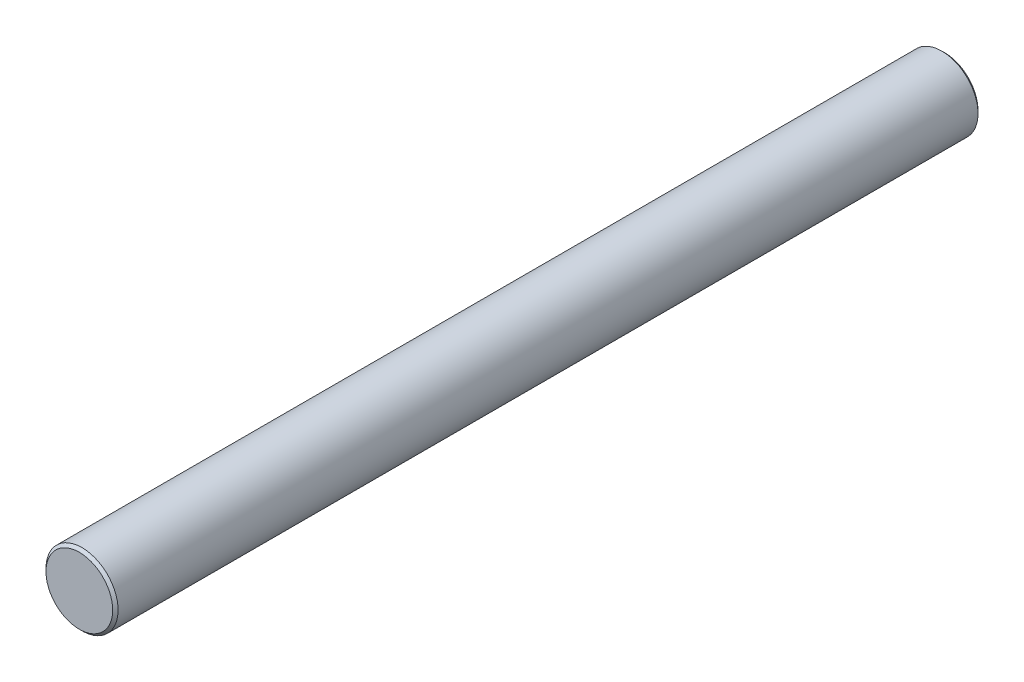
ISO-10303-21;
HEADER;
FILE_DESCRIPTION(('STEP AP214'),'2;1');
FILE_NAME('part.step','',(''),(''),'','','');
FILE_SCHEMA(('AUTOMOTIVE_DESIGN { 1 0 10303 214 1 1 1 1 }'));
ENDSEC;
DATA;
#1=APPLICATION_CONTEXT('core data for automotive mechanical design processes');
#2=APPLICATION_PROTOCOL_DEFINITION('international standard','automotive_design',2000,#1);
#3=PRODUCT_CONTEXT('',#1,'mechanical');
#4=PRODUCT('Part','Part','',(#3));
#5=PRODUCT_RELATED_PRODUCT_CATEGORY('part','',(#4));
#6=PRODUCT_DEFINITION_FORMATION('','',#4);
#7=PRODUCT_DEFINITION_CONTEXT('part definition',#1,'design');
#8=PRODUCT_DEFINITION('design','',#6,#7);
#9=PRODUCT_DEFINITION_SHAPE('','',#8);
#10=(LENGTH_UNIT() NAMED_UNIT(*) SI_UNIT(.MILLI.,.METRE.));
#11=(NAMED_UNIT(*) PLANE_ANGLE_UNIT() SI_UNIT($,.RADIAN.));
#12=(NAMED_UNIT(*) SI_UNIT($,.STERADIAN.) SOLID_ANGLE_UNIT());
#13=UNCERTAINTY_MEASURE_WITH_UNIT(LENGTH_MEASURE(1.E-05),#10,'distance_accuracy_value','');
#14=(GEOMETRIC_REPRESENTATION_CONTEXT(3) GLOBAL_UNCERTAINTY_ASSIGNED_CONTEXT((#13)) GLOBAL_UNIT_ASSIGNED_CONTEXT((#10,
#11,#12)) REPRESENTATION_CONTEXT('',''));
#15=CARTESIAN_POINT('',(0.,0.,0.));
#16=DIRECTION('',(0.,0.,1.));
#17=DIRECTION('',(1.,0.,0.));
#18=AXIS2_PLACEMENT_3D('',#15,#16,#17);
#19=CARTESIAN_POINT('',(0.,9.25,0.));
#20=DIRECTION('',(0.,0.,-1.));
#21=DIRECTION('',(0.,1.,0.));
#22=AXIS2_PLACEMENT_3D('',#19,#20,#21);
#23=PLANE('',#22);
#24=CARTESIAN_POINT('',(0.,0.,0.));
#25=DIRECTION('',(0.,0.,-1.));
#26=DIRECTION('',(0.,1.,0.));
#27=AXIS2_PLACEMENT_3D('',#24,#25,#26);
#28=CIRCLE('',#27,18.5);
#29=CARTESIAN_POINT('',(0.,18.5,0.));
#30=VERTEX_POINT('',#29);
#31=EDGE_CURVE('E9',#30,#30,#28,.T.);
#32=ORIENTED_EDGE('',*,*,#31,.T.);
#33=EDGE_LOOP('',(#32));
#34=FACE_BOUND('',#33,.T.);
#35=CARTESIAN_POINT('',(0.,0.,0.));
#36=DIRECTION('',(0.,0.,1.));
#37=DIRECTION('',(-1.,0.,0.));
#38=AXIS2_PLACEMENT_3D('',#35,#36,#37);
#39=CIRCLE('',#38,6.);
#40=CARTESIAN_POINT('',(-6.,0.,0.));
#41=VERTEX_POINT('',#40);
#42=EDGE_CURVE('E52',#41,#41,#39,.T.);
#43=ORIENTED_EDGE('',*,*,#42,.T.);
#44=EDGE_LOOP('',(#43));
#45=FACE_BOUND('',#44,.T.);
#46=ADVANCED_FACE('F15',(#34,#45),#23,.T.);
#47=CARTESIAN_POINT('',(0.,0.,0.75));
#48=DIRECTION('',(0.,0.,1.));
#49=DIRECTION('',(0.,1.,0.));
#50=AXIS2_PLACEMENT_3D('',#47,#48,#49);
#51=CONICAL_SURFACE('',#50,19.25,0.785398163397448);
#52=CARTESIAN_POINT('',(0.,0.,1.5));
#53=DIRECTION('',(0.,0.,-1.));
#54=DIRECTION('',(0.,1.,0.));
#55=AXIS2_PLACEMENT_3D('',#52,#53,#54);
#56=CIRCLE('',#55,20.);
#57=CARTESIAN_POINT('',(0.,20.,1.5));
#58=VERTEX_POINT('',#57);
#59=EDGE_CURVE('E25',#58,#58,#56,.T.);
#60=ORIENTED_EDGE('',*,*,#59,.T.);
#61=EDGE_LOOP('',(#60));
#62=FACE_BOUND('',#61,.T.);
#63=ORIENTED_EDGE('',*,*,#31,.F.);
#64=EDGE_LOOP('',(#63));
#65=FACE_BOUND('',#64,.T.);
#66=ADVANCED_FACE('F121',(#62,#65),#51,.T.);
#67=CARTESIAN_POINT('',(0.,0.,240.));
#68=DIRECTION('',(0.,0.,1.));
#69=DIRECTION('',(0.,1.,0.));
#70=AXIS2_PLACEMENT_3D('',#67,#68,#69);
#71=CYLINDRICAL_SURFACE('',#70,20.);
#72=CARTESIAN_POINT('',(0.,0.,478.5));
#73=DIRECTION('',(0.,0.,-1.));
#74=DIRECTION('',(0.,1.,0.));
#75=AXIS2_PLACEMENT_3D('',#72,#73,#74);
#76=CIRCLE('',#75,20.);
#77=CARTESIAN_POINT('',(0.,20.,478.5));
#78=VERTEX_POINT('',#77);
#79=EDGE_CURVE('E19',#78,#78,#76,.T.);
#80=ORIENTED_EDGE('',*,*,#79,.T.);
#81=EDGE_LOOP('',(#80));
#82=FACE_BOUND('',#81,.T.);
#83=ORIENTED_EDGE('',*,*,#59,.F.);
#84=EDGE_LOOP('',(#83));
#85=FACE_BOUND('',#84,.T.);
#86=CARTESIAN_POINT('',(0.,0.,6.5));
#87=DIRECTION('',(0.,0.,-1.));
#88=DIRECTION('',(0.,1.,0.));
#89=AXIS2_PLACEMENT_3D('',#86,#87,#88);
#90=CIRCLE('',#89,20.);
#91=CARTESIAN_POINT('',(10.5356537528527,-17.,6.5));
#92=VERTEX_POINT('',#91);
#93=CARTESIAN_POINT('',(-10.5356537528527,-17.,6.5));
#94=VERTEX_POINT('',#93);
#95=EDGE_CURVE('E69',#92,#94,#90,.T.);
#96=ORIENTED_EDGE('',*,*,#95,.T.);
#97=DIRECTION('',(0.,0.,1.));
#98=VECTOR('',#97,1.);
#99=CARTESIAN_POINT('',(-10.5356537528527,-17.,8.25));
#100=LINE('',#99,#98);
#101=CARTESIAN_POINT('',(-10.5356537528527,-17.,10.));
#102=VERTEX_POINT('',#101);
#103=EDGE_CURVE('E62',#94,#102,#100,.T.);
#104=ORIENTED_EDGE('',*,*,#103,.T.);
#105=CARTESIAN_POINT('',(0.,0.,10.));
#106=DIRECTION('',(0.,0.,1.));
#107=DIRECTION('',(0.,1.,0.));
#108=AXIS2_PLACEMENT_3D('',#105,#106,#107);
#109=CIRCLE('',#108,20.);
#110=CARTESIAN_POINT('',(10.5356537528527,-17.,10.));
#111=VERTEX_POINT('',#110);
#112=EDGE_CURVE('E75',#102,#111,#109,.T.);
#113=ORIENTED_EDGE('',*,*,#112,.T.);
#114=DIRECTION('',(0.,0.,-1.));
#115=VECTOR('',#114,1.);
#116=CARTESIAN_POINT('',(10.5356537528527,-17.,8.25));
#117=LINE('',#116,#115);
#118=EDGE_CURVE('E60',#111,#92,#117,.T.);
#119=ORIENTED_EDGE('',*,*,#118,.T.);
#120=EDGE_LOOP('',(#96,#104,#113,#119));
#121=FACE_BOUND('',#120,.T.);
#122=ADVANCED_FACE('F17',(#82,#85,#121),#71,.T.);
#123=CARTESIAN_POINT('',(0.,0.,479.25));
#124=DIRECTION('',(0.,0.,-1.));
#125=DIRECTION('',(0.,1.,0.));
#126=AXIS2_PLACEMENT_3D('',#123,#124,#125);
#127=CONICAL_SURFACE('',#126,19.25,0.785398163397448);
#128=CARTESIAN_POINT('',(0.,0.,480.));
#129=DIRECTION('',(0.,0.,-1.));
#130=DIRECTION('',(0.,1.,0.));
#131=AXIS2_PLACEMENT_3D('',#128,#129,#130);
#132=CIRCLE('',#131,18.5);
#133=CARTESIAN_POINT('',(0.,18.5,480.));
#134=VERTEX_POINT('',#133);
#135=EDGE_CURVE('E44',#134,#134,#132,.T.);
#136=ORIENTED_EDGE('',*,*,#135,.T.);
#137=EDGE_LOOP('',(#136));
#138=FACE_BOUND('',#137,.T.);
#139=ORIENTED_EDGE('',*,*,#79,.F.);
#140=EDGE_LOOP('',(#139));
#141=FACE_BOUND('',#140,.T.);
#142=ADVANCED_FACE('F116',(#138,#141),#127,.T.);
#143=CARTESIAN_POINT('',(0.,9.25,480.));
#144=DIRECTION('',(0.,0.,1.));
#145=DIRECTION('',(0.,-1.,0.));
#146=AXIS2_PLACEMENT_3D('',#143,#144,#145);
#147=PLANE('',#146);
#148=ORIENTED_EDGE('',*,*,#135,.F.);
#149=EDGE_LOOP('',(#148));
#150=FACE_BOUND('',#149,.T.);
#151=ADVANCED_FACE('F110',(#150),#147,.T.);
#152=CARTESIAN_POINT('',(0.,0.,26.4586213285198));
#153=DIRECTION('',(0.,0.,-1.));
#154=DIRECTION('',(-1.,0.,0.));
#155=AXIS2_PLACEMENT_3D('',#152,#153,#154);
#156=CONICAL_SURFACE('',#155,2.52640625,1.0471975511966);
#157=CARTESIAN_POINT('',(0.,0.,25.));
#158=DIRECTION('',(0.,0.,1.));
#159=DIRECTION('',(-1.,0.,0.));
#160=AXIS2_PLACEMENT_3D('',#157,#158,#159);
#161=CIRCLE('',#160,5.0528125);
#162=CARTESIAN_POINT('',(-5.0528125,0.,25.));
#163=VERTEX_POINT('',#162);
#164=EDGE_CURVE('E51',#163,#163,#161,.T.);
#165=ORIENTED_EDGE('',*,*,#164,.F.);
#166=EDGE_LOOP('',(#165));
#167=FACE_BOUND('',#166,.T.);
#168=CARTESIAN_POINT('',(0.,0.,27.9172426570397));
#169=VERTEX_POINT('',#168);
#170=VERTEX_LOOP('',#169);
#171=FACE_BOUND('',#170,.T.);
#172=ADVANCED_FACE('F104',(#167,#171),#156,.F.);
#173=CARTESIAN_POINT('',(0.,0.,12.97359375));
#174=DIRECTION('',(0.,0.,-1.));
#175=DIRECTION('',(-1.,0.,0.));
#176=AXIS2_PLACEMENT_3D('',#173,#174,#175);
#177=CYLINDRICAL_SURFACE('',#176,5.0528125);
#178=CARTESIAN_POINT('',(0.,0.,0.9471875));
#179=DIRECTION('',(0.,0.,1.));
#180=DIRECTION('',(-1.,0.,0.));
#181=AXIS2_PLACEMENT_3D('',#178,#179,#180);
#182=CIRCLE('',#181,5.0528125);
#183=CARTESIAN_POINT('',(-5.0528125,0.,0.9471875));
#184=VERTEX_POINT('',#183);
#185=EDGE_CURVE('E57',#184,#184,#182,.T.);
#186=ORIENTED_EDGE('',*,*,#185,.F.);
#187=EDGE_LOOP('',(#186));
#188=FACE_BOUND('',#187,.T.);
#189=ORIENTED_EDGE('',*,*,#164,.T.);
#190=EDGE_LOOP('',(#189));
#191=FACE_BOUND('',#190,.T.);
#192=ADVANCED_FACE('F101',(#188,#191),#177,.F.);
#193=CARTESIAN_POINT('',(0.,0.,0.47359375));
#194=DIRECTION('',(0.,0.,-1.));
#195=DIRECTION('',(-1.,0.,0.));
#196=AXIS2_PLACEMENT_3D('',#193,#194,#195);
#197=CONICAL_SURFACE('',#196,5.52640625,0.785398163397448);
#198=ORIENTED_EDGE('',*,*,#42,.F.);
#199=EDGE_LOOP('',(#198));
#200=FACE_BOUND('',#199,.T.);
#201=ORIENTED_EDGE('',*,*,#185,.T.);
#202=EDGE_LOOP('',(#201));
#203=FACE_BOUND('',#202,.T.);
#204=ADVANCED_FACE('F99',(#200,#203),#197,.F.);
#205=CARTESIAN_POINT('',(0.,-17.,8.25));
#206=DIRECTION('',(0.,-1.,0.));
#207=DIRECTION('',(0.,0.,-1.));
#208=AXIS2_PLACEMENT_3D('',#205,#206,#207);
#209=PLANE('',#208);
#210=ORIENTED_EDGE('',*,*,#103,.F.);
#211=DIRECTION('',(1.,0.,0.));
#212=VECTOR('',#211,1.);
#213=CARTESIAN_POINT('',(0.,-17.,6.5));
#214=LINE('',#213,#212);
#215=EDGE_CURVE('E66',#94,#92,#214,.T.);
#216=ORIENTED_EDGE('',*,*,#215,.T.);
#217=ORIENTED_EDGE('',*,*,#118,.F.);
#218=DIRECTION('',(-1.,0.,0.));
#219=VECTOR('',#218,1.);
#220=CARTESIAN_POINT('',(0.,-17.,10.));
#221=LINE('',#220,#219);
#222=EDGE_CURVE('E72',#111,#102,#221,.T.);
#223=ORIENTED_EDGE('',*,*,#222,.T.);
#224=EDGE_LOOP('',(#210,#216,#217,#223));
#225=FACE_BOUND('',#224,.T.);
#226=ADVANCED_FACE('F131',(#225),#209,.T.);
#227=CARTESIAN_POINT('',(0.,-19.5,6.5));
#228=DIRECTION('',(0.,0.,1.));
#229=DIRECTION('',(1.,0.,0.));
#230=AXIS2_PLACEMENT_3D('',#227,#228,#229);
#231=PLANE('',#230);
#232=ORIENTED_EDGE('',*,*,#95,.F.);
#233=ORIENTED_EDGE('',*,*,#215,.F.);
#234=EDGE_LOOP('',(#232,#233));
#235=FACE_BOUND('',#234,.T.);
#236=ADVANCED_FACE('F135',(#235),#231,.T.);
#237=CARTESIAN_POINT('',(0.,-19.5,10.));
#238=DIRECTION('',(0.,0.,1.));
#239=DIRECTION('',(1.,0.,0.));
#240=AXIS2_PLACEMENT_3D('',#237,#238,#239);
#241=PLANE('',#240);
#242=ORIENTED_EDGE('',*,*,#112,.F.);
#243=ORIENTED_EDGE('',*,*,#222,.F.);
#244=EDGE_LOOP('',(#242,#243));
#245=FACE_BOUND('',#244,.T.);
#246=ADVANCED_FACE('F87',(#245),#241,.F.);
#247=CLOSED_SHELL('',(#46,#66,#122,#142,#151,#172,#192,#204,#226,#236,#246));
#248=MANIFOLD_SOLID_BREP('B1',#247);
#249=ADVANCED_BREP_SHAPE_REPRESENTATION('',(#18,#248),#14);
#250=SHAPE_DEFINITION_REPRESENTATION(#9,#249);
ENDSEC;
END-ISO-10303-21;
